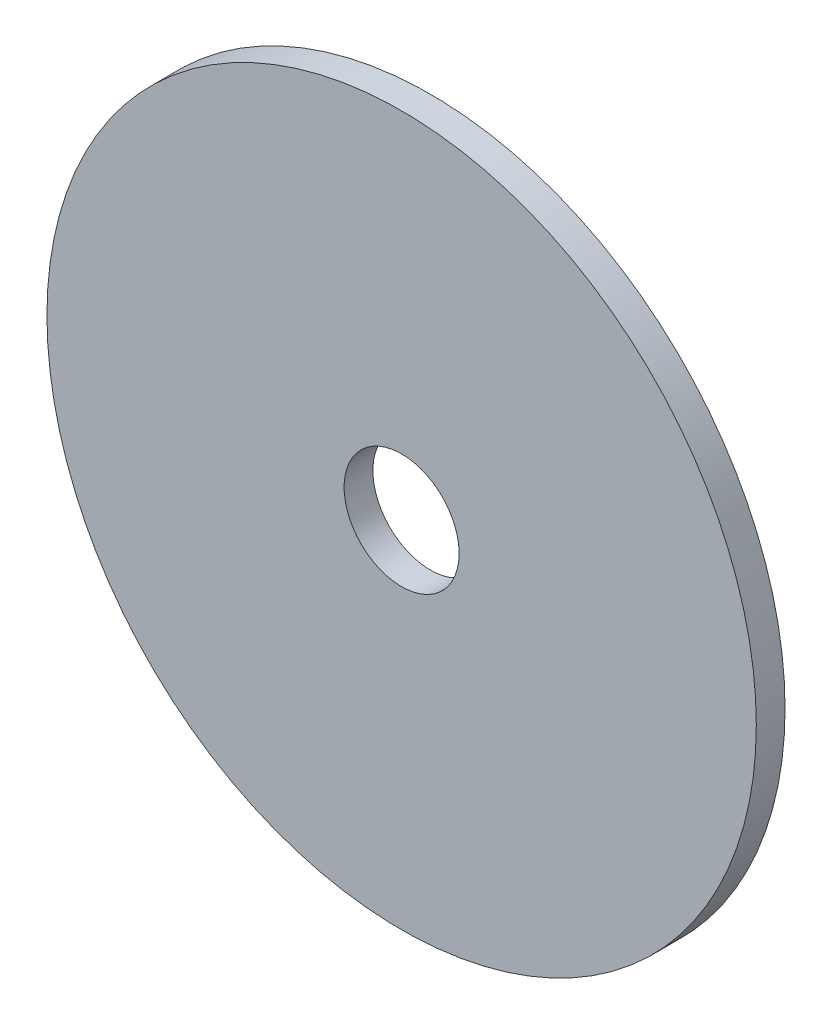
ISO-10303-21;
HEADER;
FILE_DESCRIPTION(('STEP AP214'),'2;1');
FILE_NAME('part.step','',(''),(''),'','','');
FILE_SCHEMA(('AUTOMOTIVE_DESIGN { 1 0 10303 214 1 1 1 1 }'));
ENDSEC;
DATA;
#1=APPLICATION_CONTEXT('core data for automotive mechanical design processes');
#2=APPLICATION_PROTOCOL_DEFINITION('international standard','automotive_design',2000,#1);
#3=PRODUCT_CONTEXT('',#1,'mechanical');
#4=PRODUCT('Part','Part','',(#3));
#5=PRODUCT_RELATED_PRODUCT_CATEGORY('part','',(#4));
#6=PRODUCT_DEFINITION_FORMATION('','',#4);
#7=PRODUCT_DEFINITION_CONTEXT('part definition',#1,'design');
#8=PRODUCT_DEFINITION('design','',#6,#7);
#9=PRODUCT_DEFINITION_SHAPE('','',#8);
#10=(LENGTH_UNIT() NAMED_UNIT(*) SI_UNIT(.MILLI.,.METRE.));
#11=(NAMED_UNIT(*) PLANE_ANGLE_UNIT() SI_UNIT($,.RADIAN.));
#12=(NAMED_UNIT(*) SI_UNIT($,.STERADIAN.) SOLID_ANGLE_UNIT());
#13=UNCERTAINTY_MEASURE_WITH_UNIT(LENGTH_MEASURE(1.E-05),#10,'distance_accuracy_value','');
#14=(GEOMETRIC_REPRESENTATION_CONTEXT(3) GLOBAL_UNCERTAINTY_ASSIGNED_CONTEXT((#13)) GLOBAL_UNIT_ASSIGNED_CONTEXT((#10,
#11,#12)) REPRESENTATION_CONTEXT('',''));
#15=CARTESIAN_POINT('',(0.,0.,0.));
#16=DIRECTION('',(0.,0.,1.));
#17=DIRECTION('',(1.,0.,0.));
#18=AXIS2_PLACEMENT_3D('',#15,#16,#17);
#19=CARTESIAN_POINT('',(0.,0.,3.));
#20=DIRECTION('',(0.,0.,1.));
#21=DIRECTION('',(1.,0.,0.));
#22=AXIS2_PLACEMENT_3D('',#19,#20,#21);
#23=PLANE('',#22);
#24=CARTESIAN_POINT('',(0.,0.,3.));
#25=DIRECTION('',(0.,0.,1.));
#26=DIRECTION('',(1.,0.,0.));
#27=AXIS2_PLACEMENT_3D('',#24,#25,#26);
#28=CIRCLE('',#27,37.);
#29=CARTESIAN_POINT('',(37.,0.,3.));
#30=VERTEX_POINT('',#29);
#31=EDGE_CURVE('E10',#30,#30,#28,.T.);
#32=ORIENTED_EDGE('',*,*,#31,.T.);
#33=EDGE_LOOP('',(#32));
#34=FACE_BOUND('',#33,.T.);
#35=CARTESIAN_POINT('',(0.,0.,3.));
#36=DIRECTION('',(0.,0.,1.));
#37=DIRECTION('',(1.,0.,0.));
#38=AXIS2_PLACEMENT_3D('',#35,#36,#37);
#39=CIRCLE('',#38,5.99999999999999);
#40=CARTESIAN_POINT('',(5.99999999999999,0.,3.));
#41=VERTEX_POINT('',#40);
#42=EDGE_CURVE('E41',#41,#41,#39,.T.);
#43=ORIENTED_EDGE('',*,*,#42,.F.);
#44=EDGE_LOOP('',(#43));
#45=FACE_BOUND('',#44,.T.);
#46=ADVANCED_FACE('F30',(#34,#45),#23,.T.);
#47=CARTESIAN_POINT('',(0.,0.,0.));
#48=DIRECTION('',(0.,0.,1.));
#49=DIRECTION('',(1.,0.,0.));
#50=AXIS2_PLACEMENT_3D('',#47,#48,#49);
#51=PLANE('',#50);
#52=CARTESIAN_POINT('',(0.,0.,0.));
#53=DIRECTION('',(0.,0.,1.));
#54=DIRECTION('',(1.,0.,0.));
#55=AXIS2_PLACEMENT_3D('',#52,#53,#54);
#56=CIRCLE('',#55,37.);
#57=CARTESIAN_POINT('',(37.,0.,0.));
#58=VERTEX_POINT('',#57);
#59=EDGE_CURVE('E34',#58,#58,#56,.T.);
#60=ORIENTED_EDGE('',*,*,#59,.F.);
#61=EDGE_LOOP('',(#60));
#62=FACE_BOUND('',#61,.T.);
#63=CARTESIAN_POINT('',(0.,0.,0.));
#64=DIRECTION('',(0.,0.,1.));
#65=DIRECTION('',(1.,0.,0.));
#66=AXIS2_PLACEMENT_3D('',#63,#64,#65);
#67=CIRCLE('',#66,5.99999999999999);
#68=CARTESIAN_POINT('',(5.99999999999999,0.,0.));
#69=VERTEX_POINT('',#68);
#70=EDGE_CURVE('E43',#69,#69,#67,.T.);
#71=ORIENTED_EDGE('',*,*,#70,.T.);
#72=EDGE_LOOP('',(#71));
#73=FACE_BOUND('',#72,.T.);
#74=ADVANCED_FACE('F53',(#62,#73),#51,.F.);
#75=CARTESIAN_POINT('',(0.,0.,3.));
#76=DIRECTION('',(0.,0.,-1.));
#77=DIRECTION('',(-1.,0.,0.));
#78=AXIS2_PLACEMENT_3D('',#75,#76,#77);
#79=CYLINDRICAL_SURFACE('',#78,37.);
#80=ORIENTED_EDGE('',*,*,#31,.F.);
#81=EDGE_LOOP('',(#80));
#82=FACE_BOUND('',#81,.T.);
#83=ORIENTED_EDGE('',*,*,#59,.T.);
#84=EDGE_LOOP('',(#83));
#85=FACE_BOUND('',#84,.T.);
#86=ADVANCED_FACE('F32',(#82,#85),#79,.T.);
#87=CARTESIAN_POINT('',(0.,0.,3.));
#88=DIRECTION('',(0.,0.,-1.));
#89=DIRECTION('',(-1.,0.,0.));
#90=AXIS2_PLACEMENT_3D('',#87,#88,#89);
#91=CYLINDRICAL_SURFACE('',#90,5.99999999999999);
#92=ORIENTED_EDGE('',*,*,#42,.T.);
#93=EDGE_LOOP('',(#92));
#94=FACE_BOUND('',#93,.T.);
#95=ORIENTED_EDGE('',*,*,#70,.F.);
#96=EDGE_LOOP('',(#95));
#97=FACE_BOUND('',#96,.T.);
#98=ADVANCED_FACE('F49',(#94,#97),#91,.F.);
#99=CLOSED_SHELL('',(#46,#74,#86,#98));
#100=MANIFOLD_SOLID_BREP('B2',#99);
#101=ADVANCED_BREP_SHAPE_REPRESENTATION('',(#18,#100),#14);
#102=SHAPE_DEFINITION_REPRESENTATION(#9,#101);
ENDSEC;
END-ISO-10303-21;
